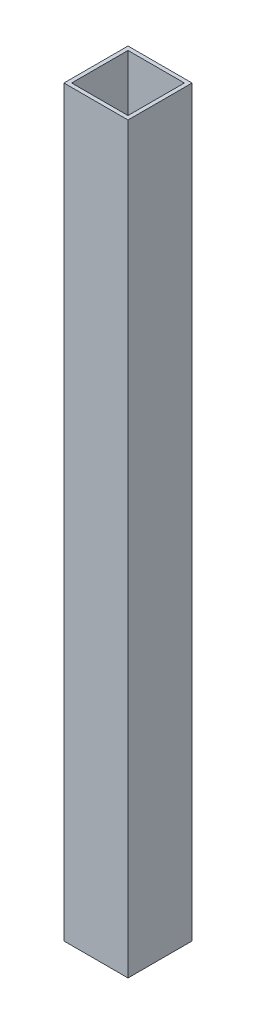
ISO-10303-21;
HEADER;
FILE_DESCRIPTION(('STEP AP214'),'2;1');
FILE_NAME('part.step','',(''),(''),'','','');
FILE_SCHEMA(('AUTOMOTIVE_DESIGN { 1 0 10303 214 1 1 1 1 }'));
ENDSEC;
DATA;
#1=APPLICATION_CONTEXT('core data for automotive mechanical design processes');
#2=APPLICATION_PROTOCOL_DEFINITION('international standard','automotive_design',2000,#1);
#3=PRODUCT_CONTEXT('',#1,'mechanical');
#4=PRODUCT('Part','Part','',(#3));
#5=PRODUCT_RELATED_PRODUCT_CATEGORY('part','',(#4));
#6=PRODUCT_DEFINITION_FORMATION('','',#4);
#7=PRODUCT_DEFINITION_CONTEXT('part definition',#1,'design');
#8=PRODUCT_DEFINITION('design','',#6,#7);
#9=PRODUCT_DEFINITION_SHAPE('','',#8);
#10=(LENGTH_UNIT() NAMED_UNIT(*) SI_UNIT(.MILLI.,.METRE.));
#11=(NAMED_UNIT(*) PLANE_ANGLE_UNIT() SI_UNIT($,.RADIAN.));
#12=(NAMED_UNIT(*) SI_UNIT($,.STERADIAN.) SOLID_ANGLE_UNIT());
#13=UNCERTAINTY_MEASURE_WITH_UNIT(LENGTH_MEASURE(1.E-05),#10,'distance_accuracy_value','');
#14=(GEOMETRIC_REPRESENTATION_CONTEXT(3) GLOBAL_UNCERTAINTY_ASSIGNED_CONTEXT((#13)) GLOBAL_UNIT_ASSIGNED_CONTEXT((#10,
#11,#12)) REPRESENTATION_CONTEXT('',''));
#15=CARTESIAN_POINT('',(0.,0.,0.));
#16=DIRECTION('',(0.,0.,1.));
#17=DIRECTION('',(1.,0.,0.));
#18=AXIS2_PLACEMENT_3D('',#15,#16,#17);
#19=CARTESIAN_POINT('',(0.,145.,0.));
#20=DIRECTION('',(0.,1.,0.));
#21=DIRECTION('',(0.,0.,1.));
#22=AXIS2_PLACEMENT_3D('',#19,#20,#21);
#23=PLANE('',#22);
#24=DIRECTION('',(0.,0.,1.));
#25=VECTOR('',#24,1.);
#26=CARTESIAN_POINT('',(-26.6277544150477,145.,-1.83717263154866));
#27=LINE('',#26,#25);
#28=CARTESIAN_POINT('',(-26.6277544150477,145.,-1.83717263154866));
#29=VERTEX_POINT('',#28);
#30=CARTESIAN_POINT('',(-26.6277544150477,145.,10.6628273684513));
#31=VERTEX_POINT('',#30);
#32=EDGE_CURVE('E136',#29,#31,#27,.T.);
#33=ORIENTED_EDGE('',*,*,#32,.T.);
#34=DIRECTION('',(1.,0.,0.));
#35=VECTOR('',#34,1.);
#36=CARTESIAN_POINT('',(-26.6277544150477,145.,10.6628273684513));
#37=LINE('',#36,#35);
#38=CARTESIAN_POINT('',(-14.1277544150477,145.,10.6628273684513));
#39=VERTEX_POINT('',#38);
#40=EDGE_CURVE('E139',#31,#39,#37,.T.);
#41=ORIENTED_EDGE('',*,*,#40,.T.);
#42=DIRECTION('',(0.,0.,-1.));
#43=VECTOR('',#42,1.);
#44=CARTESIAN_POINT('',(-14.1277544150477,145.,-1.83717263154866));
#45=LINE('',#44,#43);
#46=CARTESIAN_POINT('',(-14.1277544150477,145.,-1.83717263154866));
#47=VERTEX_POINT('',#46);
#48=EDGE_CURVE('E142',#39,#47,#45,.T.);
#49=ORIENTED_EDGE('',*,*,#48,.T.);
#50=DIRECTION('',(-1.,0.,0.));
#51=VECTOR('',#50,1.);
#52=CARTESIAN_POINT('',(-26.6277544150477,145.,-1.83717263154866));
#53=LINE('',#52,#51);
#54=EDGE_CURVE('E144',#47,#29,#53,.T.);
#55=ORIENTED_EDGE('',*,*,#54,.T.);
#56=EDGE_LOOP('',(#33,#41,#49,#55));
#57=FACE_BOUND('',#56,.T.);
#58=DIRECTION('',(-1.,0.,0.));
#59=VECTOR('',#58,1.);
#60=CARTESIAN_POINT('',(-25.8777544150477,145.,-1.08717263154866));
#61=LINE('',#60,#59);
#62=CARTESIAN_POINT('',(-14.8777544150477,145.,-1.08717263154866));
#63=VERTEX_POINT('',#62);
#64=CARTESIAN_POINT('',(-25.8777544150477,145.,-1.08717263154866));
#65=VERTEX_POINT('',#64);
#66=EDGE_CURVE('E108',#63,#65,#61,.T.);
#67=ORIENTED_EDGE('',*,*,#66,.F.);
#68=DIRECTION('',(0.,0.,-1.));
#69=VECTOR('',#68,1.);
#70=CARTESIAN_POINT('',(-14.8777544150477,145.,-1.08717263154866));
#71=LINE('',#70,#69);
#72=CARTESIAN_POINT('',(-14.8777544150477,145.,9.91282736845134));
#73=VERTEX_POINT('',#72);
#74=EDGE_CURVE('E100',#73,#63,#71,.T.);
#75=ORIENTED_EDGE('',*,*,#74,.F.);
#76=DIRECTION('',(1.,0.,0.));
#77=VECTOR('',#76,1.);
#78=CARTESIAN_POINT('',(-25.8777544150477,145.,9.91282736845134));
#79=LINE('',#78,#77);
#80=CARTESIAN_POINT('',(-25.8777544150477,145.,9.91282736845134));
#81=VERTEX_POINT('',#80);
#82=EDGE_CURVE('E122',#81,#73,#79,.T.);
#83=ORIENTED_EDGE('',*,*,#82,.F.);
#84=DIRECTION('',(0.,0.,1.));
#85=VECTOR('',#84,1.);
#86=CARTESIAN_POINT('',(-25.8777544150477,145.,-1.08717263154866));
#87=LINE('',#86,#85);
#88=EDGE_CURVE('E120',#65,#81,#87,.T.);
#89=ORIENTED_EDGE('',*,*,#88,.F.);
#90=EDGE_LOOP('',(#67,#75,#83,#89));
#91=FACE_BOUND('',#90,.T.);
#92=ADVANCED_FACE('F35',(#57,#91),#23,.T.);
#93=CARTESIAN_POINT('',(0.,0.,0.));
#94=DIRECTION('',(0.,1.,0.));
#95=DIRECTION('',(0.,0.,1.));
#96=AXIS2_PLACEMENT_3D('',#93,#94,#95);
#97=PLANE('',#96);
#98=DIRECTION('',(0.,0.,1.));
#99=VECTOR('',#98,1.);
#100=CARTESIAN_POINT('',(-26.6277544150477,0.,-1.83717263154866));
#101=LINE('',#100,#99);
#102=CARTESIAN_POINT('',(-26.6277544150477,0.,-1.83717263154866));
#103=VERTEX_POINT('',#102);
#104=CARTESIAN_POINT('',(-26.6277544150477,0.,10.6628273684513));
#105=VERTEX_POINT('',#104);
#106=EDGE_CURVE('E116',#103,#105,#101,.T.);
#107=ORIENTED_EDGE('',*,*,#106,.F.);
#108=DIRECTION('',(-1.,0.,0.));
#109=VECTOR('',#108,1.);
#110=CARTESIAN_POINT('',(-26.6277544150477,0.,-1.83717263154866));
#111=LINE('',#110,#109);
#112=CARTESIAN_POINT('',(-14.1277544150477,0.,-1.83717263154866));
#113=VERTEX_POINT('',#112);
#114=EDGE_CURVE('E140',#113,#103,#111,.T.);
#115=ORIENTED_EDGE('',*,*,#114,.F.);
#116=DIRECTION('',(0.,0.,-1.));
#117=VECTOR('',#116,1.);
#118=CARTESIAN_POINT('',(-14.1277544150477,0.,-1.83717263154866));
#119=LINE('',#118,#117);
#120=CARTESIAN_POINT('',(-14.1277544150477,0.,10.6628273684513));
#121=VERTEX_POINT('',#120);
#122=EDGE_CURVE('E151',#121,#113,#119,.T.);
#123=ORIENTED_EDGE('',*,*,#122,.F.);
#124=DIRECTION('',(1.,0.,0.));
#125=VECTOR('',#124,1.);
#126=CARTESIAN_POINT('',(-26.6277544150477,0.,10.6628273684513));
#127=LINE('',#126,#125);
#128=EDGE_CURVE('E149',#105,#121,#127,.T.);
#129=ORIENTED_EDGE('',*,*,#128,.F.);
#130=EDGE_LOOP('',(#107,#115,#123,#129));
#131=FACE_BOUND('',#130,.T.);
#132=DIRECTION('',(0.,0.,-1.));
#133=VECTOR('',#132,1.);
#134=CARTESIAN_POINT('',(-14.8777544150477,0.,-1.08717263154866));
#135=LINE('',#134,#133);
#136=CARTESIAN_POINT('',(-14.8777544150477,0.,9.91282736845134));
#137=VERTEX_POINT('',#136);
#138=CARTESIAN_POINT('',(-14.8777544150477,0.,-1.08717263154866));
#139=VERTEX_POINT('',#138);
#140=EDGE_CURVE('E58',#137,#139,#135,.T.);
#141=ORIENTED_EDGE('',*,*,#140,.T.);
#142=DIRECTION('',(-1.,0.,0.));
#143=VECTOR('',#142,1.);
#144=CARTESIAN_POINT('',(-25.8777544150477,0.,-1.08717263154866));
#145=LINE('',#144,#143);
#146=CARTESIAN_POINT('',(-25.8777544150477,0.,-1.08717263154866));
#147=VERTEX_POINT('',#146);
#148=EDGE_CURVE('E115',#139,#147,#145,.T.);
#149=ORIENTED_EDGE('',*,*,#148,.T.);
#150=DIRECTION('',(0.,0.,1.));
#151=VECTOR('',#150,1.);
#152=CARTESIAN_POINT('',(-25.8777544150477,0.,-1.08717263154866));
#153=LINE('',#152,#151);
#154=CARTESIAN_POINT('',(-25.8777544150477,0.,9.91282736845134));
#155=VERTEX_POINT('',#154);
#156=EDGE_CURVE('E128',#147,#155,#153,.T.);
#157=ORIENTED_EDGE('',*,*,#156,.T.);
#158=DIRECTION('',(1.,0.,0.));
#159=VECTOR('',#158,1.);
#160=CARTESIAN_POINT('',(-25.8777544150477,0.,9.91282736845134));
#161=LINE('',#160,#159);
#162=EDGE_CURVE('E109',#155,#137,#161,.T.);
#163=ORIENTED_EDGE('',*,*,#162,.T.);
#164=EDGE_LOOP('',(#141,#149,#157,#163));
#165=FACE_BOUND('',#164,.T.);
#166=ADVANCED_FACE('F169',(#131,#165),#97,.F.);
#167=CARTESIAN_POINT('',(-26.6277544150477,145.,-1.83717263154866));
#168=DIRECTION('',(1.,0.,0.));
#169=DIRECTION('',(0.,0.,-1.));
#170=AXIS2_PLACEMENT_3D('',#167,#168,#169);
#171=PLANE('',#170);
#172=ORIENTED_EDGE('',*,*,#106,.T.);
#173=DIRECTION('',(0.,-1.,0.));
#174=VECTOR('',#173,1.);
#175=CARTESIAN_POINT('',(-26.6277544150477,145.,10.6628273684513));
#176=LINE('',#175,#174);
#177=EDGE_CURVE('E11',#31,#105,#176,.T.);
#178=ORIENTED_EDGE('',*,*,#177,.F.);
#179=ORIENTED_EDGE('',*,*,#32,.F.);
#180=DIRECTION('',(0.,-1.,0.));
#181=VECTOR('',#180,1.);
#182=CARTESIAN_POINT('',(-26.6277544150477,145.,-1.83717263154866));
#183=LINE('',#182,#181);
#184=EDGE_CURVE('E146',#29,#103,#183,.T.);
#185=ORIENTED_EDGE('',*,*,#184,.T.);
#186=EDGE_LOOP('',(#172,#178,#179,#185));
#187=FACE_BOUND('',#186,.T.);
#188=ADVANCED_FACE('F37',(#187),#171,.F.);
#189=CARTESIAN_POINT('',(-26.6277544150477,145.,10.6628273684513));
#190=DIRECTION('',(0.,0.,-1.));
#191=DIRECTION('',(-1.,0.,0.));
#192=AXIS2_PLACEMENT_3D('',#189,#190,#191);
#193=PLANE('',#192);
#194=ORIENTED_EDGE('',*,*,#128,.T.);
#195=DIRECTION('',(0.,-1.,0.));
#196=VECTOR('',#195,1.);
#197=CARTESIAN_POINT('',(-14.1277544150477,145.,10.6628273684513));
#198=LINE('',#197,#196);
#199=EDGE_CURVE('E43',#39,#121,#198,.T.);
#200=ORIENTED_EDGE('',*,*,#199,.F.);
#201=ORIENTED_EDGE('',*,*,#40,.F.);
#202=ORIENTED_EDGE('',*,*,#177,.T.);
#203=EDGE_LOOP('',(#194,#200,#201,#202));
#204=FACE_BOUND('',#203,.T.);
#205=ADVANCED_FACE('F179',(#204),#193,.F.);
#206=CARTESIAN_POINT('',(-14.1277544150477,145.,-1.83717263154866));
#207=DIRECTION('',(-1.,0.,0.));
#208=DIRECTION('',(0.,0.,1.));
#209=AXIS2_PLACEMENT_3D('',#206,#207,#208);
#210=PLANE('',#209);
#211=ORIENTED_EDGE('',*,*,#122,.T.);
#212=DIRECTION('',(0.,-1.,0.));
#213=VECTOR('',#212,1.);
#214=CARTESIAN_POINT('',(-14.1277544150477,145.,-1.83717263154866));
#215=LINE('',#214,#213);
#216=EDGE_CURVE('E156',#47,#113,#215,.T.);
#217=ORIENTED_EDGE('',*,*,#216,.F.);
#218=ORIENTED_EDGE('',*,*,#48,.F.);
#219=ORIENTED_EDGE('',*,*,#199,.T.);
#220=EDGE_LOOP('',(#211,#217,#218,#219));
#221=FACE_BOUND('',#220,.T.);
#222=ADVANCED_FACE('F163',(#221),#210,.F.);
#223=CARTESIAN_POINT('',(-26.6277544150477,145.,-1.83717263154866));
#224=DIRECTION('',(0.,0.,1.));
#225=DIRECTION('',(1.,0.,0.));
#226=AXIS2_PLACEMENT_3D('',#223,#224,#225);
#227=PLANE('',#226);
#228=ORIENTED_EDGE('',*,*,#114,.T.);
#229=ORIENTED_EDGE('',*,*,#184,.F.);
#230=ORIENTED_EDGE('',*,*,#54,.F.);
#231=ORIENTED_EDGE('',*,*,#216,.T.);
#232=EDGE_LOOP('',(#228,#229,#230,#231));
#233=FACE_BOUND('',#232,.T.);
#234=ADVANCED_FACE('F173',(#233),#227,.F.);
#235=CARTESIAN_POINT('',(-14.8777544150477,145.,-1.08717263154866));
#236=DIRECTION('',(-1.,0.,0.));
#237=DIRECTION('',(0.,0.,1.));
#238=AXIS2_PLACEMENT_3D('',#235,#236,#237);
#239=PLANE('',#238);
#240=ORIENTED_EDGE('',*,*,#140,.F.);
#241=DIRECTION('',(0.,-1.,0.));
#242=VECTOR('',#241,1.);
#243=CARTESIAN_POINT('',(-14.8777544150477,145.,9.91282736845134));
#244=LINE('',#243,#242);
#245=EDGE_CURVE('E104',#73,#137,#244,.T.);
#246=ORIENTED_EDGE('',*,*,#245,.F.);
#247=ORIENTED_EDGE('',*,*,#74,.T.);
#248=DIRECTION('',(0.,-1.,0.));
#249=VECTOR('',#248,1.);
#250=CARTESIAN_POINT('',(-14.8777544150477,145.,-1.08717263154866));
#251=LINE('',#250,#249);
#252=EDGE_CURVE('E103',#63,#139,#251,.T.);
#253=ORIENTED_EDGE('',*,*,#252,.T.);
#254=EDGE_LOOP('',(#240,#246,#247,#253));
#255=FACE_BOUND('',#254,.T.);
#256=ADVANCED_FACE('F102',(#255),#239,.T.);
#257=CARTESIAN_POINT('',(-25.8777544150477,145.,-1.08717263154866));
#258=DIRECTION('',(0.,0.,1.));
#259=DIRECTION('',(1.,0.,0.));
#260=AXIS2_PLACEMENT_3D('',#257,#258,#259);
#261=PLANE('',#260);
#262=ORIENTED_EDGE('',*,*,#148,.F.);
#263=ORIENTED_EDGE('',*,*,#252,.F.);
#264=ORIENTED_EDGE('',*,*,#66,.T.);
#265=DIRECTION('',(0.,-1.,0.));
#266=VECTOR('',#265,1.);
#267=CARTESIAN_POINT('',(-25.8777544150477,145.,-1.08717263154866));
#268=LINE('',#267,#266);
#269=EDGE_CURVE('E117',#65,#147,#268,.T.);
#270=ORIENTED_EDGE('',*,*,#269,.T.);
#271=EDGE_LOOP('',(#262,#263,#264,#270));
#272=FACE_BOUND('',#271,.T.);
#273=ADVANCED_FACE('F112',(#272),#261,.T.);
#274=CARTESIAN_POINT('',(-25.8777544150477,145.,-1.08717263154866));
#275=DIRECTION('',(1.,0.,0.));
#276=DIRECTION('',(0.,0.,-1.));
#277=AXIS2_PLACEMENT_3D('',#274,#275,#276);
#278=PLANE('',#277);
#279=ORIENTED_EDGE('',*,*,#156,.F.);
#280=ORIENTED_EDGE('',*,*,#269,.F.);
#281=ORIENTED_EDGE('',*,*,#88,.T.);
#282=DIRECTION('',(0.,-1.,0.));
#283=VECTOR('',#282,1.);
#284=CARTESIAN_POINT('',(-25.8777544150477,145.,9.91282736845134));
#285=LINE('',#284,#283);
#286=EDGE_CURVE('E50',#81,#155,#285,.T.);
#287=ORIENTED_EDGE('',*,*,#286,.T.);
#288=EDGE_LOOP('',(#279,#280,#281,#287));
#289=FACE_BOUND('',#288,.T.);
#290=ADVANCED_FACE('F202',(#289),#278,.T.);
#291=CARTESIAN_POINT('',(-25.8777544150477,145.,9.91282736845134));
#292=DIRECTION('',(0.,0.,-1.));
#293=DIRECTION('',(-1.,0.,0.));
#294=AXIS2_PLACEMENT_3D('',#291,#292,#293);
#295=PLANE('',#294);
#296=ORIENTED_EDGE('',*,*,#162,.F.);
#297=ORIENTED_EDGE('',*,*,#286,.F.);
#298=ORIENTED_EDGE('',*,*,#82,.T.);
#299=ORIENTED_EDGE('',*,*,#245,.T.);
#300=EDGE_LOOP('',(#296,#297,#298,#299));
#301=FACE_BOUND('',#300,.T.);
#302=ADVANCED_FACE('F206',(#301),#295,.T.);
#303=CLOSED_SHELL('',(#92,#166,#188,#205,#222,#234,#256,#273,#290,#302));
#304=MANIFOLD_SOLID_BREP('B2',#303);
#305=ADVANCED_BREP_SHAPE_REPRESENTATION('',(#18,#304),#14);
#306=SHAPE_DEFINITION_REPRESENTATION(#9,#305);
ENDSEC;
END-ISO-10303-21;
